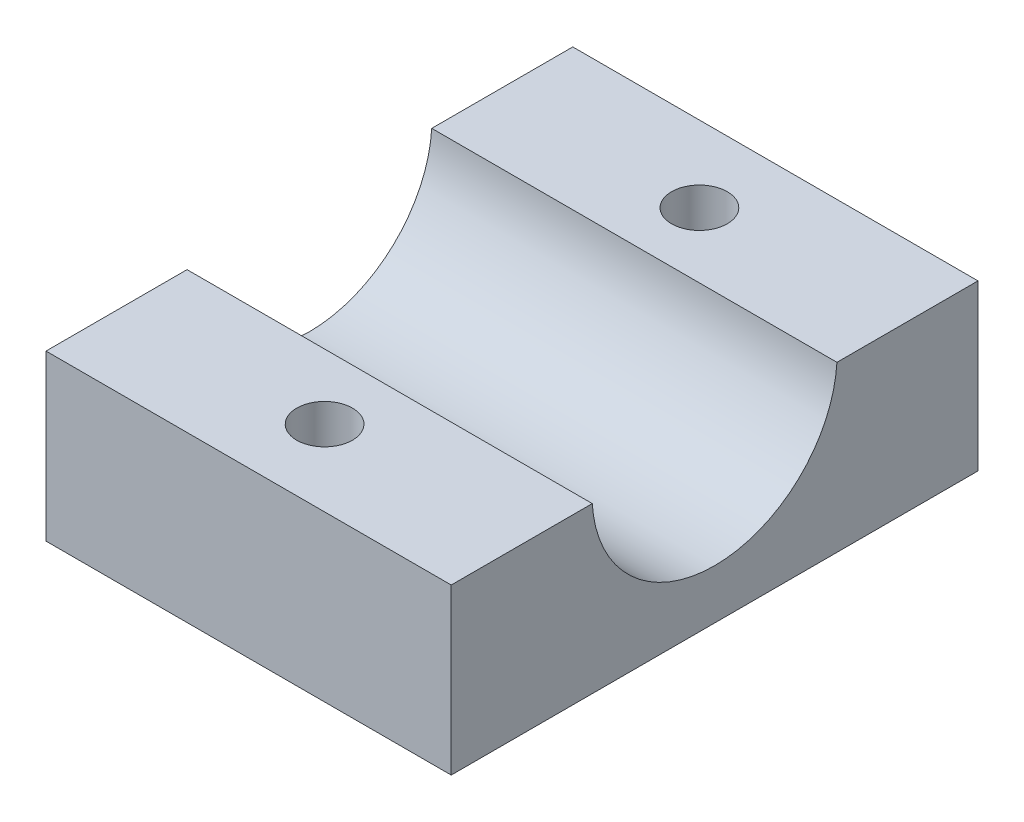
ISO-10303-21;
HEADER;
FILE_DESCRIPTION(('STEP AP214'),'2;1');
FILE_NAME('part.step','',(''),(''),'','','');
FILE_SCHEMA(('AUTOMOTIVE_DESIGN { 1 0 10303 214 1 1 1 1 }'));
ENDSEC;
DATA;
#1=APPLICATION_CONTEXT('core data for automotive mechanical design processes');
#2=APPLICATION_PROTOCOL_DEFINITION('international standard','automotive_design',2000,#1);
#3=PRODUCT_CONTEXT('',#1,'mechanical');
#4=PRODUCT('Part','Part','',(#3));
#5=PRODUCT_RELATED_PRODUCT_CATEGORY('part','',(#4));
#6=PRODUCT_DEFINITION_FORMATION('','',#4);
#7=PRODUCT_DEFINITION_CONTEXT('part definition',#1,'design');
#8=PRODUCT_DEFINITION('design','',#6,#7);
#9=PRODUCT_DEFINITION_SHAPE('','',#8);
#10=(LENGTH_UNIT() NAMED_UNIT(*) SI_UNIT(.MILLI.,.METRE.));
#11=(NAMED_UNIT(*) PLANE_ANGLE_UNIT() SI_UNIT($,.RADIAN.));
#12=(NAMED_UNIT(*) SI_UNIT($,.STERADIAN.) SOLID_ANGLE_UNIT());
#13=UNCERTAINTY_MEASURE_WITH_UNIT(LENGTH_MEASURE(1.E-05),#10,'distance_accuracy_value','');
#14=(GEOMETRIC_REPRESENTATION_CONTEXT(3) GLOBAL_UNCERTAINTY_ASSIGNED_CONTEXT((#13)) GLOBAL_UNIT_ASSIGNED_CONTEXT((#10,
#11,#12)) REPRESENTATION_CONTEXT('',''));
#15=CARTESIAN_POINT('',(0.,0.,0.));
#16=DIRECTION('',(0.,0.,1.));
#17=DIRECTION('',(1.,0.,0.));
#18=AXIS2_PLACEMENT_3D('',#15,#16,#17);
#19=CARTESIAN_POINT('',(20.,-12.75,-26.));
#20=DIRECTION('',(0.,-1.,0.));
#21=DIRECTION('',(0.,0.,-1.));
#22=AXIS2_PLACEMENT_3D('',#19,#20,#21);
#23=PLANE('',#22);
#24=CARTESIAN_POINT('',(0.,-12.75,-18.5));
#25=DIRECTION('',(0.,-1.,0.));
#26=DIRECTION('',(0.,0.,-1.));
#27=AXIS2_PLACEMENT_3D('',#24,#25,#26);
#28=CIRCLE('',#27,2.75);
#29=CARTESIAN_POINT('',(0.,-12.75,-15.75));
#30=VERTEX_POINT('',#29);
#31=EDGE_CURVE('E150',#30,#30,#28,.T.);
#32=ORIENTED_EDGE('',*,*,#31,.T.);
#33=EDGE_LOOP('',(#32));
#34=FACE_BOUND('',#33,.T.);
#35=DIRECTION('',(0.,0.,1.));
#36=VECTOR('',#35,1.);
#37=CARTESIAN_POINT('',(-20.,-12.75,-26.));
#38=LINE('',#37,#36);
#39=CARTESIAN_POINT('',(-20.,-12.75,-26.));
#40=VERTEX_POINT('',#39);
#41=CARTESIAN_POINT('',(-20.,-12.75,-12.0767338299724));
#42=VERTEX_POINT('',#41);
#43=EDGE_CURVE('E114',#40,#42,#38,.T.);
#44=ORIENTED_EDGE('',*,*,#43,.T.);
#45=DIRECTION('',(1.,0.,0.));
#46=VECTOR('',#45,1.);
#47=CARTESIAN_POINT('',(-20.,-12.75,-12.0767338299724));
#48=LINE('',#47,#46);
#49=CARTESIAN_POINT('',(20.,-12.75,-12.0767338299724));
#50=VERTEX_POINT('',#49);
#51=EDGE_CURVE('E55',#42,#50,#48,.T.);
#52=ORIENTED_EDGE('',*,*,#51,.T.);
#53=DIRECTION('',(0.,0.,1.));
#54=VECTOR('',#53,1.);
#55=CARTESIAN_POINT('',(20.,-12.75,-26.));
#56=LINE('',#55,#54);
#57=CARTESIAN_POINT('',(20.,-12.75,-26.));
#58=VERTEX_POINT('',#57);
#59=EDGE_CURVE('E125',#58,#50,#56,.T.);
#60=ORIENTED_EDGE('',*,*,#59,.F.);
#61=DIRECTION('',(-1.,0.,0.));
#62=VECTOR('',#61,1.);
#63=CARTESIAN_POINT('',(20.,-12.75,-26.));
#64=LINE('',#63,#62);
#65=EDGE_CURVE('E124',#58,#40,#64,.T.);
#66=ORIENTED_EDGE('',*,*,#65,.T.);
#67=EDGE_LOOP('',(#44,#52,#60,#66));
#68=FACE_BOUND('',#67,.T.);
#69=ADVANCED_FACE('F39',(#34,#68),#23,.F.);
#70=CARTESIAN_POINT('',(20.,-12.75,26.));
#71=DIRECTION('',(0.,0.,-1.));
#72=DIRECTION('',(-1.,0.,0.));
#73=AXIS2_PLACEMENT_3D('',#70,#71,#72);
#74=PLANE('',#73);
#75=DIRECTION('',(0.,-1.,0.));
#76=VECTOR('',#75,1.);
#77=CARTESIAN_POINT('',(-20.,-12.75,26.));
#78=LINE('',#77,#76);
#79=CARTESIAN_POINT('',(-20.,-12.75,26.));
#80=VERTEX_POINT('',#79);
#81=CARTESIAN_POINT('',(-20.,-29.,26.));
#82=VERTEX_POINT('',#81);
#83=EDGE_CURVE('E113',#80,#82,#78,.T.);
#84=ORIENTED_EDGE('',*,*,#83,.T.);
#85=DIRECTION('',(-1.,0.,0.));
#86=VECTOR('',#85,1.);
#87=CARTESIAN_POINT('',(20.,-29.,26.));
#88=LINE('',#87,#86);
#89=CARTESIAN_POINT('',(20.,-29.,26.));
#90=VERTEX_POINT('',#89);
#91=EDGE_CURVE('E11',#90,#82,#88,.T.);
#92=ORIENTED_EDGE('',*,*,#91,.F.);
#93=DIRECTION('',(0.,-1.,0.));
#94=VECTOR('',#93,1.);
#95=CARTESIAN_POINT('',(20.,-12.75,26.));
#96=LINE('',#95,#94);
#97=CARTESIAN_POINT('',(20.,-12.75,26.));
#98=VERTEX_POINT('',#97);
#99=EDGE_CURVE('E117',#98,#90,#96,.T.);
#100=ORIENTED_EDGE('',*,*,#99,.F.);
#101=DIRECTION('',(-1.,0.,0.));
#102=VECTOR('',#101,1.);
#103=CARTESIAN_POINT('',(20.,-12.75,26.));
#104=LINE('',#103,#102);
#105=EDGE_CURVE('E122',#98,#80,#104,.T.);
#106=ORIENTED_EDGE('',*,*,#105,.T.);
#107=EDGE_LOOP('',(#84,#92,#100,#106));
#108=FACE_BOUND('',#107,.T.);
#109=ADVANCED_FACE('F41',(#108),#74,.F.);
#110=CARTESIAN_POINT('',(20.,-29.,26.));
#111=DIRECTION('',(0.,1.,0.));
#112=DIRECTION('',(0.,0.,1.));
#113=AXIS2_PLACEMENT_3D('',#110,#111,#112);
#114=PLANE('',#113);
#115=CARTESIAN_POINT('',(0.,-29.,18.5));
#116=DIRECTION('',(0.,1.,0.));
#117=DIRECTION('',(0.,0.,1.));
#118=AXIS2_PLACEMENT_3D('',#115,#116,#117);
#119=CIRCLE('',#118,2.75);
#120=CARTESIAN_POINT('',(0.,-29.,21.25));
#121=VERTEX_POINT('',#120);
#122=EDGE_CURVE('E156',#121,#121,#119,.T.);
#123=ORIENTED_EDGE('',*,*,#122,.T.);
#124=EDGE_LOOP('',(#123));
#125=FACE_BOUND('',#124,.T.);
#126=CARTESIAN_POINT('',(0.,-29.,-18.5));
#127=DIRECTION('',(0.,1.,0.));
#128=DIRECTION('',(0.,0.,1.));
#129=AXIS2_PLACEMENT_3D('',#126,#127,#128);
#130=CIRCLE('',#129,2.75);
#131=CARTESIAN_POINT('',(0.,-29.,-15.75));
#132=VERTEX_POINT('',#131);
#133=EDGE_CURVE('E153',#132,#132,#130,.T.);
#134=ORIENTED_EDGE('',*,*,#133,.T.);
#135=EDGE_LOOP('',(#134));
#136=FACE_BOUND('',#135,.T.);
#137=DIRECTION('',(0.,0.,-1.));
#138=VECTOR('',#137,1.);
#139=CARTESIAN_POINT('',(-20.,-29.,26.));
#140=LINE('',#139,#138);
#141=CARTESIAN_POINT('',(-20.,-29.,-26.));
#142=VERTEX_POINT('',#141);
#143=EDGE_CURVE('E118',#82,#142,#140,.T.);
#144=ORIENTED_EDGE('',*,*,#143,.T.);
#145=DIRECTION('',(-1.,0.,0.));
#146=VECTOR('',#145,1.);
#147=CARTESIAN_POINT('',(20.,-29.,-26.));
#148=LINE('',#147,#146);
#149=CARTESIAN_POINT('',(20.,-29.,-26.));
#150=VERTEX_POINT('',#149);
#151=EDGE_CURVE('E48',#150,#142,#148,.T.);
#152=ORIENTED_EDGE('',*,*,#151,.F.);
#153=DIRECTION('',(0.,0.,-1.));
#154=VECTOR('',#153,1.);
#155=CARTESIAN_POINT('',(20.,-29.,26.));
#156=LINE('',#155,#154);
#157=EDGE_CURVE('E93',#90,#150,#156,.T.);
#158=ORIENTED_EDGE('',*,*,#157,.F.);
#159=ORIENTED_EDGE('',*,*,#91,.T.);
#160=EDGE_LOOP('',(#144,#152,#158,#159));
#161=FACE_BOUND('',#160,.T.);
#162=ADVANCED_FACE('F142',(#125,#136,#161),#114,.F.);
#163=CARTESIAN_POINT('',(20.,-29.,-26.));
#164=DIRECTION('',(0.,0.,1.));
#165=DIRECTION('',(1.,0.,0.));
#166=AXIS2_PLACEMENT_3D('',#163,#164,#165);
#167=PLANE('',#166);
#168=DIRECTION('',(0.,1.,0.));
#169=VECTOR('',#168,1.);
#170=CARTESIAN_POINT('',(-20.,-29.,-26.));
#171=LINE('',#170,#169);
#172=EDGE_CURVE('E115',#142,#40,#171,.T.);
#173=ORIENTED_EDGE('',*,*,#172,.T.);
#174=ORIENTED_EDGE('',*,*,#65,.F.);
#175=DIRECTION('',(0.,1.,0.));
#176=VECTOR('',#175,1.);
#177=CARTESIAN_POINT('',(20.,-29.,-26.));
#178=LINE('',#177,#176);
#179=EDGE_CURVE('E134',#150,#58,#178,.T.);
#180=ORIENTED_EDGE('',*,*,#179,.F.);
#181=ORIENTED_EDGE('',*,*,#151,.T.);
#182=EDGE_LOOP('',(#173,#174,#180,#181));
#183=FACE_BOUND('',#182,.T.);
#184=ADVANCED_FACE('F132',(#183),#167,.F.);
#185=CARTESIAN_POINT('',(0.,-12.75,18.5));
#186=DIRECTION('',(0.,-1.,0.));
#187=DIRECTION('',(0.,0.,-1.));
#188=AXIS2_PLACEMENT_3D('',#185,#186,#187);
#189=CIRCLE('',#188,2.75);
#190=CARTESIAN_POINT('',(0.,-12.75,21.25));
#191=VERTEX_POINT('',#190);
#192=EDGE_CURVE('E43',#191,#191,#189,.T.);
#193=ORIENTED_EDGE('',*,*,#192,.T.);
#194=EDGE_LOOP('',(#193));
#195=FACE_BOUND('',#194,.T.);
#196=CARTESIAN_POINT('',(20.,-12.75,12.0767338299724));
#197=VERTEX_POINT('',#196);
#198=EDGE_CURVE('E64',#197,#98,#56,.T.);
#199=ORIENTED_EDGE('',*,*,#198,.F.);
#200=DIRECTION('',(1.,0.,0.));
#201=VECTOR('',#200,1.);
#202=CARTESIAN_POINT('',(-20.,-12.75,12.0767338299724));
#203=LINE('',#202,#201);
#204=CARTESIAN_POINT('',(-20.,-12.75,12.0767338299724));
#205=VERTEX_POINT('',#204);
#206=EDGE_CURVE('E102',#197,#205,#203,.F.);
#207=ORIENTED_EDGE('',*,*,#206,.T.);
#208=EDGE_CURVE('E86',#205,#80,#38,.T.);
#209=ORIENTED_EDGE('',*,*,#208,.T.);
#210=ORIENTED_EDGE('',*,*,#105,.F.);
#211=EDGE_LOOP('',(#199,#207,#209,#210));
#212=FACE_BOUND('',#211,.T.);
#213=ADVANCED_FACE('F108',(#195,#212),#23,.F.);
#214=CARTESIAN_POINT('',(20.,0.,0.));
#215=DIRECTION('',(1.,0.,0.));
#216=DIRECTION('',(0.,0.,-1.));
#217=AXIS2_PLACEMENT_3D('',#214,#215,#216);
#218=PLANE('',#217);
#219=CARTESIAN_POINT('',(20.,-12.,0.));
#220=DIRECTION('',(1.,0.,0.));
#221=DIRECTION('',(0.,0.,-1.));
#222=AXIS2_PLACEMENT_3D('',#219,#220,#221);
#223=CIRCLE('',#222,12.1);
#224=EDGE_CURVE('E106',#197,#50,#223,.T.);
#225=ORIENTED_EDGE('',*,*,#224,.F.);
#226=ORIENTED_EDGE('',*,*,#198,.T.);
#227=ORIENTED_EDGE('',*,*,#99,.T.);
#228=ORIENTED_EDGE('',*,*,#157,.T.);
#229=ORIENTED_EDGE('',*,*,#179,.T.);
#230=ORIENTED_EDGE('',*,*,#59,.T.);
#231=EDGE_LOOP('',(#225,#226,#227,#228,#229,#230));
#232=FACE_BOUND('',#231,.T.);
#233=ADVANCED_FACE('F186',(#232),#218,.T.);
#234=CARTESIAN_POINT('',(-20.,0.,0.));
#235=DIRECTION('',(1.,0.,0.));
#236=DIRECTION('',(0.,0.,-1.));
#237=AXIS2_PLACEMENT_3D('',#234,#235,#236);
#238=PLANE('',#237);
#239=ORIENTED_EDGE('',*,*,#208,.F.);
#240=CARTESIAN_POINT('',(-20.,-12.,0.));
#241=DIRECTION('',(1.,0.,0.));
#242=DIRECTION('',(0.,0.,-1.));
#243=AXIS2_PLACEMENT_3D('',#240,#241,#242);
#244=CIRCLE('',#243,12.1);
#245=EDGE_CURVE('E100',#205,#42,#244,.T.);
#246=ORIENTED_EDGE('',*,*,#245,.T.);
#247=ORIENTED_EDGE('',*,*,#43,.F.);
#248=ORIENTED_EDGE('',*,*,#172,.F.);
#249=ORIENTED_EDGE('',*,*,#143,.F.);
#250=ORIENTED_EDGE('',*,*,#83,.F.);
#251=EDGE_LOOP('',(#239,#246,#247,#248,#249,#250));
#252=FACE_BOUND('',#251,.T.);
#253=ADVANCED_FACE('F111',(#252),#238,.F.);
#254=CARTESIAN_POINT('',(-20.,-12.,0.));
#255=DIRECTION('',(1.,0.,0.));
#256=DIRECTION('',(0.,0.,-1.));
#257=AXIS2_PLACEMENT_3D('',#254,#255,#256);
#258=CYLINDRICAL_SURFACE('',#257,12.1);
#259=ORIENTED_EDGE('',*,*,#245,.F.);
#260=ORIENTED_EDGE('',*,*,#206,.F.);
#261=ORIENTED_EDGE('',*,*,#224,.T.);
#262=ORIENTED_EDGE('',*,*,#51,.F.);
#263=EDGE_LOOP('',(#259,#260,#261,#262));
#264=FACE_BOUND('',#263,.T.);
#265=ADVANCED_FACE('F101',(#264),#258,.F.);
#266=CARTESIAN_POINT('',(0.,-29.,18.5));
#267=DIRECTION('',(0.,1.,0.));
#268=DIRECTION('',(0.,0.,1.));
#269=AXIS2_PLACEMENT_3D('',#266,#267,#268);
#270=CYLINDRICAL_SURFACE('',#269,2.75);
#271=CARTESIAN_POINT('',(0.,-29.,21.25));
#272=CARTESIAN_POINT('',(0.,-28.8307291666667,21.25));
#273=CARTESIAN_POINT('',(0.,-28.6614583333333,21.25));
#274=CARTESIAN_POINT('',(0.,-28.3229166666667,21.25));
#275=CARTESIAN_POINT('',(0.,-28.1536458333333,21.25));
#276=CARTESIAN_POINT('',(0.,-27.8151041666667,21.25));
#277=CARTESIAN_POINT('',(0.,-27.6458333333333,21.25));
#278=CARTESIAN_POINT('',(0.,-27.3072916666667,21.25));
#279=CARTESIAN_POINT('',(0.,-27.1380208333333,21.25));
#280=CARTESIAN_POINT('',(0.,-26.7994791666667,21.25));
#281=CARTESIAN_POINT('',(0.,-26.6302083333333,21.25));
#282=CARTESIAN_POINT('',(0.,-26.2916666666667,21.25));
#283=CARTESIAN_POINT('',(0.,-26.1223958333333,21.25));
#284=CARTESIAN_POINT('',(0.,-25.7838541666667,21.25));
#285=CARTESIAN_POINT('',(0.,-25.6145833333333,21.25));
#286=CARTESIAN_POINT('',(0.,-25.2760416666667,21.25));
#287=CARTESIAN_POINT('',(0.,-25.1067708333333,21.25));
#288=CARTESIAN_POINT('',(0.,-24.7682291666667,21.25));
#289=CARTESIAN_POINT('',(0.,-24.5989583333333,21.25));
#290=CARTESIAN_POINT('',(0.,-24.2604166666667,21.25));
#291=CARTESIAN_POINT('',(0.,-24.0911458333333,21.25));
#292=CARTESIAN_POINT('',(0.,-23.7526041666667,21.25));
#293=CARTESIAN_POINT('',(0.,-23.5833333333333,21.25));
#294=CARTESIAN_POINT('',(0.,-23.2447916666667,21.25));
#295=CARTESIAN_POINT('',(0.,-23.0755208333333,21.25));
#296=CARTESIAN_POINT('',(0.,-22.7369791666667,21.25));
#297=CARTESIAN_POINT('',(0.,-22.5677083333333,21.25));
#298=CARTESIAN_POINT('',(0.,-22.2291666666667,21.25));
#299=CARTESIAN_POINT('',(0.,-22.0598958333333,21.25));
#300=CARTESIAN_POINT('',(0.,-21.7213541666667,21.25));
#301=CARTESIAN_POINT('',(0.,-21.5520833333333,21.25));
#302=CARTESIAN_POINT('',(0.,-21.2135416666667,21.25));
#303=CARTESIAN_POINT('',(0.,-21.0442708333333,21.25));
#304=CARTESIAN_POINT('',(0.,-20.7057291666667,21.25));
#305=CARTESIAN_POINT('',(0.,-20.5364583333333,21.25));
#306=CARTESIAN_POINT('',(0.,-20.1979166666667,21.25));
#307=CARTESIAN_POINT('',(0.,-20.0286458333333,21.25));
#308=CARTESIAN_POINT('',(0.,-19.6901041666667,21.25));
#309=CARTESIAN_POINT('',(0.,-19.5208333333333,21.25));
#310=CARTESIAN_POINT('',(0.,-19.1822916666667,21.25));
#311=CARTESIAN_POINT('',(0.,-19.0130208333333,21.25));
#312=CARTESIAN_POINT('',(0.,-18.6744791666667,21.25));
#313=CARTESIAN_POINT('',(0.,-18.5052083333333,21.25));
#314=CARTESIAN_POINT('',(0.,-18.1666666666667,21.25));
#315=CARTESIAN_POINT('',(0.,-17.9973958333333,21.25));
#316=CARTESIAN_POINT('',(0.,-17.6588541666667,21.25));
#317=CARTESIAN_POINT('',(0.,-17.4895833333333,21.25));
#318=CARTESIAN_POINT('',(0.,-17.1510416666667,21.25));
#319=CARTESIAN_POINT('',(0.,-16.9817708333333,21.25));
#320=CARTESIAN_POINT('',(0.,-16.6432291666667,21.25));
#321=CARTESIAN_POINT('',(0.,-16.4739583333333,21.25));
#322=CARTESIAN_POINT('',(0.,-16.1354166666667,21.25));
#323=CARTESIAN_POINT('',(0.,-15.9661458333333,21.25));
#324=CARTESIAN_POINT('',(0.,-15.6276041666667,21.25));
#325=CARTESIAN_POINT('',(0.,-15.4583333333333,21.25));
#326=CARTESIAN_POINT('',(0.,-15.1197916666667,21.25));
#327=CARTESIAN_POINT('',(0.,-14.9505208333333,21.25));
#328=CARTESIAN_POINT('',(0.,-14.6119791666667,21.25));
#329=CARTESIAN_POINT('',(0.,-14.4427083333333,21.25));
#330=CARTESIAN_POINT('',(0.,-14.1041666666667,21.25));
#331=CARTESIAN_POINT('',(0.,-13.9348958333333,21.25));
#332=CARTESIAN_POINT('',(0.,-13.5963541666667,21.25));
#333=CARTESIAN_POINT('',(0.,-13.4270833333333,21.25));
#334=CARTESIAN_POINT('',(0.,-13.0885416666667,21.25));
#335=CARTESIAN_POINT('',(0.,-12.9192708333333,21.25));
#336=CARTESIAN_POINT('',(0.,-12.75,21.25));
#337=B_SPLINE_CURVE_WITH_KNOTS('',3,(#271,#272,#273,#274,#275,#276,#277,#278,#279,#280,#281,
#282,#283,#284,#285,#286,#287,#288,#289,#290,#291,#292,#293,#294,#295,#296,#297,#298,#299,#300,
#301,#302,#303,#304,#305,#306,#307,#308,#309,#310,#311,#312,#313,#314,#315,#316,#317,#318,#319,
#320,#321,#322,#323,#324,#325,#326,#327,#328,#329,#330,#331,#332,#333,#334,#335,#336),
.UNSPECIFIED.,.F.,.F.,(4,2,2,2,2,2,2,2,2,2,2,2,2,2,2,2,2,2,2,2,2,2,2,2,2,2,2,2,2,2,2,2,4),(0.,
0.5078125,1.015625,1.5234375,2.03125,2.5390625,3.046875,3.5546875,4.0625,4.5703125,5.078125,
5.5859375,6.09375,6.6015625,7.109375,7.6171875,8.125,8.6328125,9.140625,9.6484375,10.15625,
10.6640625,11.171875,11.6796875,12.1875,12.6953125,13.203125,13.7109375,14.21875,14.7265625,
15.234375,15.7421875,16.25),.UNSPECIFIED.);
#338=EDGE_CURVE('BSEAM164',#121,#191,#337,.T.);
#339=ORIENTED_EDGE('',*,*,#122,.F.);
#340=ORIENTED_EDGE('',*,*,#192,.F.);
#341=ORIENTED_EDGE('',*,*,#338,.T.);
#342=ORIENTED_EDGE('',*,*,#338,.F.);
#343=EDGE_LOOP('',(#339,#341,#340,#342));
#344=FACE_BOUND('',#343,.T.);
#345=ADVANCED_FACE('F164',(#344),#270,.F.);
#346=CARTESIAN_POINT('',(0.,-29.,-18.5));
#347=DIRECTION('',(0.,1.,0.));
#348=DIRECTION('',(0.,0.,1.));
#349=AXIS2_PLACEMENT_3D('',#346,#347,#348);
#350=CYLINDRICAL_SURFACE('',#349,2.75);
#351=CARTESIAN_POINT('',(0.,-29.,-15.75));
#352=CARTESIAN_POINT('',(0.,-28.8307291666667,-15.75));
#353=CARTESIAN_POINT('',(0.,-28.6614583333333,-15.75));
#354=CARTESIAN_POINT('',(0.,-28.3229166666667,-15.75));
#355=CARTESIAN_POINT('',(0.,-28.1536458333333,-15.75));
#356=CARTESIAN_POINT('',(0.,-27.8151041666667,-15.75));
#357=CARTESIAN_POINT('',(0.,-27.6458333333333,-15.75));
#358=CARTESIAN_POINT('',(0.,-27.3072916666667,-15.75));
#359=CARTESIAN_POINT('',(0.,-27.1380208333333,-15.75));
#360=CARTESIAN_POINT('',(0.,-26.7994791666667,-15.75));
#361=CARTESIAN_POINT('',(0.,-26.6302083333333,-15.75));
#362=CARTESIAN_POINT('',(0.,-26.2916666666667,-15.75));
#363=CARTESIAN_POINT('',(0.,-26.1223958333333,-15.75));
#364=CARTESIAN_POINT('',(0.,-25.7838541666667,-15.75));
#365=CARTESIAN_POINT('',(0.,-25.6145833333333,-15.75));
#366=CARTESIAN_POINT('',(0.,-25.2760416666667,-15.75));
#367=CARTESIAN_POINT('',(0.,-25.1067708333333,-15.75));
#368=CARTESIAN_POINT('',(0.,-24.7682291666667,-15.75));
#369=CARTESIAN_POINT('',(0.,-24.5989583333333,-15.75));
#370=CARTESIAN_POINT('',(0.,-24.2604166666667,-15.75));
#371=CARTESIAN_POINT('',(0.,-24.0911458333333,-15.75));
#372=CARTESIAN_POINT('',(0.,-23.7526041666667,-15.75));
#373=CARTESIAN_POINT('',(0.,-23.5833333333333,-15.75));
#374=CARTESIAN_POINT('',(0.,-23.2447916666667,-15.75));
#375=CARTESIAN_POINT('',(0.,-23.0755208333333,-15.75));
#376=CARTESIAN_POINT('',(0.,-22.7369791666667,-15.75));
#377=CARTESIAN_POINT('',(0.,-22.5677083333333,-15.75));
#378=CARTESIAN_POINT('',(0.,-22.2291666666667,-15.75));
#379=CARTESIAN_POINT('',(0.,-22.0598958333333,-15.75));
#380=CARTESIAN_POINT('',(0.,-21.7213541666667,-15.75));
#381=CARTESIAN_POINT('',(0.,-21.5520833333333,-15.75));
#382=CARTESIAN_POINT('',(0.,-21.2135416666667,-15.75));
#383=CARTESIAN_POINT('',(0.,-21.0442708333333,-15.75));
#384=CARTESIAN_POINT('',(0.,-20.7057291666667,-15.75));
#385=CARTESIAN_POINT('',(0.,-20.5364583333333,-15.75));
#386=CARTESIAN_POINT('',(0.,-20.1979166666667,-15.75));
#387=CARTESIAN_POINT('',(0.,-20.0286458333333,-15.75));
#388=CARTESIAN_POINT('',(0.,-19.6901041666667,-15.75));
#389=CARTESIAN_POINT('',(0.,-19.5208333333333,-15.75));
#390=CARTESIAN_POINT('',(0.,-19.1822916666667,-15.75));
#391=CARTESIAN_POINT('',(0.,-19.0130208333333,-15.75));
#392=CARTESIAN_POINT('',(0.,-18.6744791666667,-15.75));
#393=CARTESIAN_POINT('',(0.,-18.5052083333333,-15.75));
#394=CARTESIAN_POINT('',(0.,-18.1666666666667,-15.75));
#395=CARTESIAN_POINT('',(0.,-17.9973958333333,-15.75));
#396=CARTESIAN_POINT('',(0.,-17.6588541666667,-15.75));
#397=CARTESIAN_POINT('',(0.,-17.4895833333333,-15.75));
#398=CARTESIAN_POINT('',(0.,-17.1510416666667,-15.75));
#399=CARTESIAN_POINT('',(0.,-16.9817708333333,-15.75));
#400=CARTESIAN_POINT('',(0.,-16.6432291666667,-15.75));
#401=CARTESIAN_POINT('',(0.,-16.4739583333333,-15.75));
#402=CARTESIAN_POINT('',(0.,-16.1354166666667,-15.75));
#403=CARTESIAN_POINT('',(0.,-15.9661458333333,-15.75));
#404=CARTESIAN_POINT('',(0.,-15.6276041666667,-15.75));
#405=CARTESIAN_POINT('',(0.,-15.4583333333333,-15.75));
#406=CARTESIAN_POINT('',(0.,-15.1197916666667,-15.75));
#407=CARTESIAN_POINT('',(0.,-14.9505208333333,-15.75));
#408=CARTESIAN_POINT('',(0.,-14.6119791666667,-15.75));
#409=CARTESIAN_POINT('',(0.,-14.4427083333333,-15.75));
#410=CARTESIAN_POINT('',(0.,-14.1041666666667,-15.75));
#411=CARTESIAN_POINT('',(0.,-13.9348958333333,-15.75));
#412=CARTESIAN_POINT('',(0.,-13.5963541666667,-15.75));
#413=CARTESIAN_POINT('',(0.,-13.4270833333333,-15.75));
#414=CARTESIAN_POINT('',(0.,-13.0885416666667,-15.75));
#415=CARTESIAN_POINT('',(0.,-12.9192708333333,-15.75));
#416=CARTESIAN_POINT('',(0.,-12.75,-15.75));
#417=B_SPLINE_CURVE_WITH_KNOTS('',3,(#351,#352,#353,#354,#355,#356,#357,#358,#359,#360,#361,
#362,#363,#364,#365,#366,#367,#368,#369,#370,#371,#372,#373,#374,#375,#376,#377,#378,#379,#380,
#381,#382,#383,#384,#385,#386,#387,#388,#389,#390,#391,#392,#393,#394,#395,#396,#397,#398,#399,
#400,#401,#402,#403,#404,#405,#406,#407,#408,#409,#410,#411,#412,#413,#414,#415,#416),
.UNSPECIFIED.,.F.,.F.,(4,2,2,2,2,2,2,2,2,2,2,2,2,2,2,2,2,2,2,2,2,2,2,2,2,2,2,2,2,2,2,2,4),(0.,
0.5078125,1.015625,1.5234375,2.03125,2.5390625,3.046875,3.5546875,4.0625,4.5703125,5.078125,
5.5859375,6.09375,6.6015625,7.109375,7.6171875,8.125,8.6328125,9.140625,9.6484375,10.15625,
10.6640625,11.171875,11.6796875,12.1875,12.6953125,13.203125,13.7109375,14.21875,14.7265625,
15.234375,15.7421875,16.25),.UNSPECIFIED.);
#418=EDGE_CURVE('BSEAM166',#132,#30,#417,.T.);
#419=ORIENTED_EDGE('',*,*,#133,.F.);
#420=ORIENTED_EDGE('',*,*,#31,.F.);
#421=ORIENTED_EDGE('',*,*,#418,.T.);
#422=ORIENTED_EDGE('',*,*,#418,.F.);
#423=EDGE_LOOP('',(#419,#421,#420,#422));
#424=FACE_BOUND('',#423,.T.);
#425=ADVANCED_FACE('F166',(#424),#350,.F.);
#426=CLOSED_SHELL('',(#69,#109,#162,#184,#213,#233,#253,#265,#345,#425));
#427=MANIFOLD_SOLID_BREP('B2',#426);
#428=ADVANCED_BREP_SHAPE_REPRESENTATION('',(#18,#427),#14);
#429=SHAPE_DEFINITION_REPRESENTATION(#9,#428);
ENDSEC;
END-ISO-10303-21;
